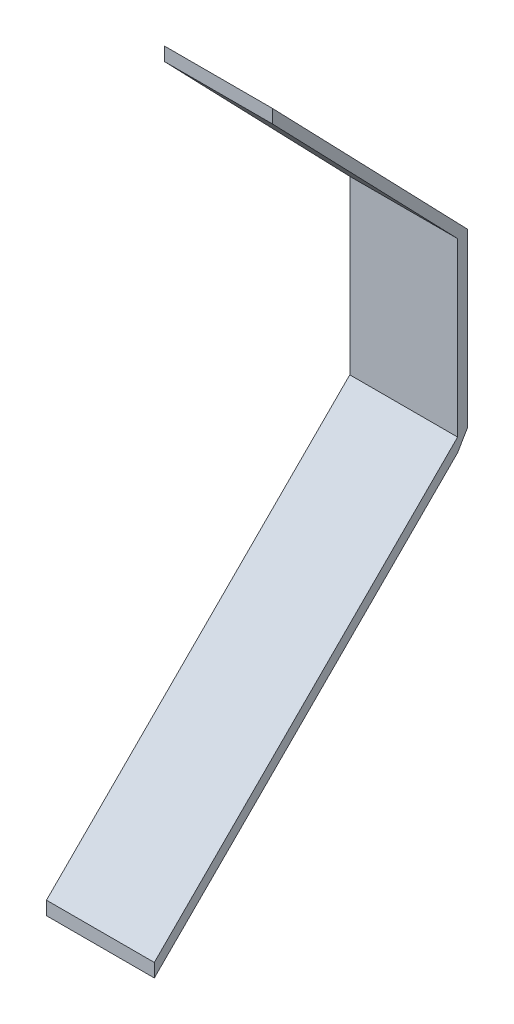
ISO-10303-21;
HEADER;
FILE_DESCRIPTION(('STEP AP214'),'2;1');
FILE_NAME('part.step','',(''),(''),'','','');
FILE_SCHEMA(('AUTOMOTIVE_DESIGN { 1 0 10303 214 1 1 1 1 }'));
ENDSEC;
DATA;
#1=APPLICATION_CONTEXT('core data for automotive mechanical design processes');
#2=APPLICATION_PROTOCOL_DEFINITION('international standard','automotive_design',2000,#1);
#3=PRODUCT_CONTEXT('',#1,'mechanical');
#4=PRODUCT('Part','Part','',(#3));
#5=PRODUCT_RELATED_PRODUCT_CATEGORY('part','',(#4));
#6=PRODUCT_DEFINITION_FORMATION('','',#4);
#7=PRODUCT_DEFINITION_CONTEXT('part definition',#1,'design');
#8=PRODUCT_DEFINITION('design','',#6,#7);
#9=PRODUCT_DEFINITION_SHAPE('','',#8);
#10=(LENGTH_UNIT() NAMED_UNIT(*) SI_UNIT(.MILLI.,.METRE.));
#11=(NAMED_UNIT(*) PLANE_ANGLE_UNIT() SI_UNIT($,.RADIAN.));
#12=(NAMED_UNIT(*) SI_UNIT($,.STERADIAN.) SOLID_ANGLE_UNIT());
#13=UNCERTAINTY_MEASURE_WITH_UNIT(LENGTH_MEASURE(1.E-05),#10,'distance_accuracy_value','');
#14=(GEOMETRIC_REPRESENTATION_CONTEXT(3) GLOBAL_UNCERTAINTY_ASSIGNED_CONTEXT((#13)) GLOBAL_UNIT_ASSIGNED_CONTEXT((#10,
#11,#12)) REPRESENTATION_CONTEXT('',''));
#15=CARTESIAN_POINT('',(0.,0.,0.));
#16=DIRECTION('',(0.,0.,1.));
#17=DIRECTION('',(1.,0.,0.));
#18=AXIS2_PLACEMENT_3D('',#15,#16,#17);
#19=CARTESIAN_POINT('',(32.,0.,0.));
#20=DIRECTION('',(0.,0.707106781186546,0.707106781186549));
#21=DIRECTION('',(0.,-0.707106781186549,0.707106781186546));
#22=AXIS2_PLACEMENT_3D('',#19,#20,#21);
#23=PLANE('',#22);
#24=DIRECTION('',(0.,0.707106781186549,-0.707106781186546));
#25=VECTOR('',#24,1.);
#26=CARTESIAN_POINT('',(0.,0.,0.));
#27=LINE('',#26,#25);
#28=CARTESIAN_POINT('',(0.,0.,0.));
#29=VERTEX_POINT('',#28);
#30=CARTESIAN_POINT('',(0.,90.0000000000003,-90.));
#31=VERTEX_POINT('',#30);
#32=EDGE_CURVE('E146',#29,#31,#27,.T.);
#33=ORIENTED_EDGE('',*,*,#32,.T.);
#34=DIRECTION('',(-1.,0.,0.));
#35=VECTOR('',#34,1.);
#36=CARTESIAN_POINT('',(32.,90.0000000000003,-90.));
#37=LINE('',#36,#35);
#38=CARTESIAN_POINT('',(32.,90.0000000000003,-90.));
#39=VERTEX_POINT('',#38);
#40=EDGE_CURVE('E11',#39,#31,#37,.T.);
#41=ORIENTED_EDGE('',*,*,#40,.F.);
#42=DIRECTION('',(0.,0.707106781186549,-0.707106781186546));
#43=VECTOR('',#42,1.);
#44=CARTESIAN_POINT('',(32.,0.,0.));
#45=LINE('',#44,#43);
#46=CARTESIAN_POINT('',(32.,0.,0.));
#47=VERTEX_POINT('',#46);
#48=EDGE_CURVE('E172',#47,#39,#45,.T.);
#49=ORIENTED_EDGE('',*,*,#48,.F.);
#50=DIRECTION('',(-1.,0.,0.));
#51=VECTOR('',#50,1.);
#52=CARTESIAN_POINT('',(32.,0.,0.));
#53=LINE('',#52,#51);
#54=EDGE_CURVE('E142',#47,#29,#53,.T.);
#55=ORIENTED_EDGE('',*,*,#54,.T.);
#56=EDGE_LOOP('',(#33,#41,#49,#55));
#57=FACE_BOUND('',#56,.T.);
#58=ADVANCED_FACE('F39',(#57),#23,.F.);
#59=CARTESIAN_POINT('',(32.,90.0000000000003,-90.));
#60=DIRECTION('',(0.,0.509841225874766,0.86026851877685));
#61=DIRECTION('',(0.,-0.86026851877685,0.509841225874766));
#62=AXIS2_PLACEMENT_3D('',#59,#60,#61);
#63=PLANE('',#62);
#64=DIRECTION('',(0.,0.86026851877685,-0.509841225874766));
#65=VECTOR('',#64,1.);
#66=CARTESIAN_POINT('',(0.,90.0000000000003,-90.));
#67=LINE('',#66,#65);
#68=CARTESIAN_POINT('',(0.,94.956001150023,-92.9371918727852));
#69=VERTEX_POINT('',#68);
#70=EDGE_CURVE('E150',#31,#69,#67,.T.);
#71=ORIENTED_EDGE('',*,*,#70,.T.);
#72=DIRECTION('',(-1.,0.,0.));
#73=VECTOR('',#72,1.);
#74=CARTESIAN_POINT('',(32.,94.956001150023,-92.9371918727852));
#75=LINE('',#74,#73);
#76=CARTESIAN_POINT('',(32.,94.956001150023,-92.9371918727852));
#77=VERTEX_POINT('',#76);
#78=EDGE_CURVE('E48',#77,#69,#75,.T.);
#79=ORIENTED_EDGE('',*,*,#78,.F.);
#80=DIRECTION('',(0.,0.86026851877685,-0.509841225874766));
#81=VECTOR('',#80,1.);
#82=CARTESIAN_POINT('',(32.,90.0000000000003,-90.));
#83=LINE('',#82,#81);
#84=EDGE_CURVE('E102',#39,#77,#83,.T.);
#85=ORIENTED_EDGE('',*,*,#84,.F.);
#86=ORIENTED_EDGE('',*,*,#40,.T.);
#87=EDGE_LOOP('',(#71,#79,#85,#86));
#88=FACE_BOUND('',#87,.T.);
#89=ADVANCED_FACE('F227',(#88),#63,.F.);
#90=CARTESIAN_POINT('',(32.,94.956001150023,-92.9371918727852));
#91=DIRECTION('',(0.,0.,1.));
#92=DIRECTION('',(0.,-1.,0.));
#93=AXIS2_PLACEMENT_3D('',#90,#91,#92);
#94=PLANE('',#93);
#95=DIRECTION('',(0.,1.,0.));
#96=VECTOR('',#95,1.);
#97=CARTESIAN_POINT('',(0.,94.956001150023,-92.9371918727852));
#98=LINE('',#97,#96);
#99=CARTESIAN_POINT('',(0.,145.956001150024,-92.9371918727852));
#100=VERTEX_POINT('',#99);
#101=EDGE_CURVE('E153',#69,#100,#98,.T.);
#102=ORIENTED_EDGE('',*,*,#101,.T.);
#103=DIRECTION('',(-1.,0.,0.));
#104=VECTOR('',#103,1.);
#105=CARTESIAN_POINT('',(32.,145.956001150024,-92.9371918727852));
#106=LINE('',#105,#104);
#107=CARTESIAN_POINT('',(32.,145.956001150024,-92.9371918727852));
#108=VERTEX_POINT('',#107);
#109=EDGE_CURVE('E187',#108,#100,#106,.T.);
#110=ORIENTED_EDGE('',*,*,#109,.F.);
#111=DIRECTION('',(0.,1.,0.));
#112=VECTOR('',#111,1.);
#113=CARTESIAN_POINT('',(32.,94.956001150023,-92.9371918727852));
#114=LINE('',#113,#112);
#115=EDGE_CURVE('E197',#77,#108,#114,.T.);
#116=ORIENTED_EDGE('',*,*,#115,.F.);
#117=ORIENTED_EDGE('',*,*,#78,.T.);
#118=EDGE_LOOP('',(#102,#110,#116,#117));
#119=FACE_BOUND('',#118,.T.);
#120=ADVANCED_FACE('F195',(#119),#94,.F.);
#121=CARTESIAN_POINT('',(32.,206.,-35.));
#122=DIRECTION('',(0.,-0.694369173833102,0.71961896197247));
#123=DIRECTION('',(0.,-0.71961896197247,-0.694369173833102));
#124=AXIS2_PLACEMENT_3D('',#121,#122,#123);
#125=PLANE('',#124);
#126=DIRECTION('',(0.,0.71961896197247,0.694369173833102));
#127=VECTOR('',#126,1.);
#128=CARTESIAN_POINT('',(0.,206.,-35.));
#129=LINE('',#128,#127);
#130=CARTESIAN_POINT('',(0.,206.,-35.));
#131=VERTEX_POINT('',#130);
#132=EDGE_CURVE('E157',#100,#131,#129,.T.);
#133=ORIENTED_EDGE('',*,*,#132,.T.);
#134=DIRECTION('',(-1.,0.,0.));
#135=VECTOR('',#134,1.);
#136=CARTESIAN_POINT('',(32.,206.,-35.));
#137=LINE('',#136,#135);
#138=CARTESIAN_POINT('',(32.,206.,-35.));
#139=VERTEX_POINT('',#138);
#140=EDGE_CURVE('E183',#139,#131,#137,.T.);
#141=ORIENTED_EDGE('',*,*,#140,.F.);
#142=DIRECTION('',(0.,0.719618961972469,0.694369173833103));
#143=VECTOR('',#142,1.);
#144=CARTESIAN_POINT('',(32.,149.000000000001,-90.));
#145=LINE('',#144,#143);
#146=EDGE_CURVE('E213',#108,#139,#145,.T.);
#147=ORIENTED_EDGE('',*,*,#146,.F.);
#148=ORIENTED_EDGE('',*,*,#109,.T.);
#149=EDGE_LOOP('',(#133,#141,#147,#148));
#150=FACE_BOUND('',#149,.T.);
#151=ADVANCED_FACE('F205',(#150),#125,.F.);
#152=CARTESIAN_POINT('',(32.,202.,-35.));
#153=DIRECTION('',(0.,0.,-1.));
#154=DIRECTION('',(0.,1.,0.));
#155=AXIS2_PLACEMENT_3D('',#152,#153,#154);
#156=PLANE('',#155);
#157=DIRECTION('',(0.,-1.,0.));
#158=VECTOR('',#157,1.);
#159=CARTESIAN_POINT('',(0.,202.,-35.));
#160=LINE('',#159,#158);
#161=CARTESIAN_POINT('',(0.,202.,-35.));
#162=VERTEX_POINT('',#161);
#163=EDGE_CURVE('E160',#131,#162,#160,.T.);
#164=ORIENTED_EDGE('',*,*,#163,.T.);
#165=DIRECTION('',(-1.,0.,0.));
#166=VECTOR('',#165,1.);
#167=CARTESIAN_POINT('',(32.,202.,-35.));
#168=LINE('',#167,#166);
#169=CARTESIAN_POINT('',(32.,202.,-35.));
#170=VERTEX_POINT('',#169);
#171=EDGE_CURVE('E179',#170,#162,#168,.T.);
#172=ORIENTED_EDGE('',*,*,#171,.F.);
#173=DIRECTION('',(0.,-1.,0.));
#174=VECTOR('',#173,1.);
#175=CARTESIAN_POINT('',(32.,202.,-35.));
#176=LINE('',#175,#174);
#177=EDGE_CURVE('E211',#139,#170,#176,.T.);
#178=ORIENTED_EDGE('',*,*,#177,.F.);
#179=ORIENTED_EDGE('',*,*,#140,.T.);
#180=EDGE_LOOP('',(#164,#172,#178,#179));
#181=FACE_BOUND('',#180,.T.);
#182=ADVANCED_FACE('F209',(#181),#156,.F.);
#183=CARTESIAN_POINT('',(32.,202.,-35.));
#184=DIRECTION('',(0.,0.694369173833102,-0.71961896197247));
#185=DIRECTION('',(0.,0.71961896197247,0.694369173833102));
#186=AXIS2_PLACEMENT_3D('',#183,#184,#185);
#187=PLANE('',#186);
#188=DIRECTION('',(0.,-0.71961896197247,-0.694369173833102));
#189=VECTOR('',#188,1.);
#190=CARTESIAN_POINT('',(0.,202.,-35.));
#191=LINE('',#190,#189);
#192=CARTESIAN_POINT('',(0.,145.000000000001,-90.));
#193=VERTEX_POINT('',#192);
#194=EDGE_CURVE('E163',#162,#193,#191,.T.);
#195=ORIENTED_EDGE('',*,*,#194,.T.);
#196=DIRECTION('',(-1.,0.,0.));
#197=VECTOR('',#196,1.);
#198=CARTESIAN_POINT('',(32.,145.000000000001,-90.));
#199=LINE('',#198,#197);
#200=CARTESIAN_POINT('',(32.,145.000000000001,-90.));
#201=VERTEX_POINT('',#200);
#202=EDGE_CURVE('E135',#201,#193,#199,.T.);
#203=ORIENTED_EDGE('',*,*,#202,.F.);
#204=DIRECTION('',(0.,-0.71961896197247,-0.694369173833102));
#205=VECTOR('',#204,1.);
#206=CARTESIAN_POINT('',(32.,202.,-35.));
#207=LINE('',#206,#205);
#208=EDGE_CURVE('E124',#170,#201,#207,.T.);
#209=ORIENTED_EDGE('',*,*,#208,.F.);
#210=ORIENTED_EDGE('',*,*,#171,.T.);
#211=EDGE_LOOP('',(#195,#203,#209,#210));
#212=FACE_BOUND('',#211,.T.);
#213=ADVANCED_FACE('F239',(#212),#187,.F.);
#214=CARTESIAN_POINT('',(32.,145.000000000001,-90.));
#215=DIRECTION('',(0.,0.,-1.));
#216=DIRECTION('',(-1.,0.,0.));
#217=AXIS2_PLACEMENT_3D('',#214,#215,#216);
#218=PLANE('',#217);
#219=DIRECTION('',(0.,-1.,0.));
#220=VECTOR('',#219,1.);
#221=CARTESIAN_POINT('',(0.,145.000000000001,-90.));
#222=LINE('',#221,#220);
#223=CARTESIAN_POINT('',(0.,94.0000000000003,-90.));
#224=VERTEX_POINT('',#223);
#225=EDGE_CURVE('E133',#193,#224,#222,.T.);
#226=ORIENTED_EDGE('',*,*,#225,.T.);
#227=DIRECTION('',(-1.,0.,0.));
#228=VECTOR('',#227,1.);
#229=CARTESIAN_POINT('',(32.,94.0000000000003,-90.));
#230=LINE('',#229,#228);
#231=CARTESIAN_POINT('',(32.,94.0000000000003,-90.));
#232=VERTEX_POINT('',#231);
#233=EDGE_CURVE('E130',#232,#224,#230,.T.);
#234=ORIENTED_EDGE('',*,*,#233,.F.);
#235=DIRECTION('',(0.,-1.,0.));
#236=VECTOR('',#235,1.);
#237=CARTESIAN_POINT('',(32.,145.000000000001,-90.));
#238=LINE('',#237,#236);
#239=EDGE_CURVE('E118',#201,#232,#238,.T.);
#240=ORIENTED_EDGE('',*,*,#239,.F.);
#241=ORIENTED_EDGE('',*,*,#202,.T.);
#242=EDGE_LOOP('',(#226,#234,#240,#241));
#243=FACE_BOUND('',#242,.T.);
#244=ADVANCED_FACE('F131',(#243),#218,.F.);
#245=CARTESIAN_POINT('',(32.,4.,0.));
#246=DIRECTION('',(0.,-0.707106781186546,-0.707106781186549));
#247=DIRECTION('',(0.,0.707106781186549,-0.707106781186546));
#248=AXIS2_PLACEMENT_3D('',#245,#246,#247);
#249=PLANE('',#248);
#250=DIRECTION('',(0.,-0.707106781186549,0.707106781186546));
#251=VECTOR('',#250,1.);
#252=CARTESIAN_POINT('',(0.,4.,0.));
#253=LINE('',#252,#251);
#254=CARTESIAN_POINT('',(0.,4.,0.));
#255=VERTEX_POINT('',#254);
#256=EDGE_CURVE('E88',#224,#255,#253,.T.);
#257=ORIENTED_EDGE('',*,*,#256,.T.);
#258=DIRECTION('',(-1.,0.,0.));
#259=VECTOR('',#258,1.);
#260=CARTESIAN_POINT('',(32.,4.,0.));
#261=LINE('',#260,#259);
#262=CARTESIAN_POINT('',(32.,4.,0.));
#263=VERTEX_POINT('',#262);
#264=EDGE_CURVE('E136',#263,#255,#261,.T.);
#265=ORIENTED_EDGE('',*,*,#264,.F.);
#266=DIRECTION('',(0.,-0.707106781186549,0.707106781186546));
#267=VECTOR('',#266,1.);
#268=CARTESIAN_POINT('',(32.,4.,0.));
#269=LINE('',#268,#267);
#270=EDGE_CURVE('E122',#232,#263,#269,.T.);
#271=ORIENTED_EDGE('',*,*,#270,.F.);
#272=ORIENTED_EDGE('',*,*,#233,.T.);
#273=EDGE_LOOP('',(#257,#265,#271,#272));
#274=FACE_BOUND('',#273,.T.);
#275=ADVANCED_FACE('F138',(#274),#249,.F.);
#276=CARTESIAN_POINT('',(32.,4.,0.));
#277=DIRECTION('',(0.,0.,-1.));
#278=DIRECTION('',(-1.,0.,0.));
#279=AXIS2_PLACEMENT_3D('',#276,#277,#278);
#280=PLANE('',#279);
#281=DIRECTION('',(0.,-1.,0.));
#282=VECTOR('',#281,1.);
#283=CARTESIAN_POINT('',(0.,4.,0.));
#284=LINE('',#283,#282);
#285=EDGE_CURVE('E94',#255,#29,#284,.T.);
#286=ORIENTED_EDGE('',*,*,#285,.T.);
#287=ORIENTED_EDGE('',*,*,#54,.F.);
#288=DIRECTION('',(0.,-1.,0.));
#289=VECTOR('',#288,1.);
#290=CARTESIAN_POINT('',(32.,4.,0.));
#291=LINE('',#290,#289);
#292=EDGE_CURVE('E56',#263,#47,#291,.T.);
#293=ORIENTED_EDGE('',*,*,#292,.F.);
#294=ORIENTED_EDGE('',*,*,#264,.T.);
#295=EDGE_LOOP('',(#286,#287,#293,#294));
#296=FACE_BOUND('',#295,.T.);
#297=ADVANCED_FACE('F247',(#296),#280,.F.);
#298=CARTESIAN_POINT('',(32.,0.,0.));
#299=DIRECTION('',(-1.,0.,0.));
#300=DIRECTION('',(0.,0.,1.));
#301=AXIS2_PLACEMENT_3D('',#298,#299,#300);
#302=PLANE('',#301);
#303=ORIENTED_EDGE('',*,*,#48,.T.);
#304=ORIENTED_EDGE('',*,*,#84,.T.);
#305=ORIENTED_EDGE('',*,*,#115,.T.);
#306=ORIENTED_EDGE('',*,*,#146,.T.);
#307=ORIENTED_EDGE('',*,*,#177,.T.);
#308=ORIENTED_EDGE('',*,*,#208,.T.);
#309=ORIENTED_EDGE('',*,*,#239,.T.);
#310=ORIENTED_EDGE('',*,*,#270,.T.);
#311=ORIENTED_EDGE('',*,*,#292,.T.);
#312=EDGE_LOOP('',(#303,#304,#305,#306,#307,#308,#309,#310,#311));
#313=FACE_BOUND('',#312,.T.);
#314=ADVANCED_FACE('F120',(#313),#302,.F.);
#315=CARTESIAN_POINT('',(0.,0.,0.));
#316=DIRECTION('',(-1.,0.,0.));
#317=DIRECTION('',(0.,0.,1.));
#318=AXIS2_PLACEMENT_3D('',#315,#316,#317);
#319=PLANE('',#318);
#320=ORIENTED_EDGE('',*,*,#32,.F.);
#321=ORIENTED_EDGE('',*,*,#285,.F.);
#322=ORIENTED_EDGE('',*,*,#256,.F.);
#323=ORIENTED_EDGE('',*,*,#225,.F.);
#324=ORIENTED_EDGE('',*,*,#194,.F.);
#325=ORIENTED_EDGE('',*,*,#163,.F.);
#326=ORIENTED_EDGE('',*,*,#132,.F.);
#327=ORIENTED_EDGE('',*,*,#101,.F.);
#328=ORIENTED_EDGE('',*,*,#70,.F.);
#329=EDGE_LOOP('',(#320,#321,#322,#323,#324,#325,#326,#327,#328));
#330=FACE_BOUND('',#329,.T.);
#331=ADVANCED_FACE('F200',(#330),#319,.T.);
#332=CLOSED_SHELL('',(#58,#89,#120,#151,#182,#213,#244,#275,#297,#314,#331));
#333=MANIFOLD_SOLID_BREP('B2',#332);
#334=ADVANCED_BREP_SHAPE_REPRESENTATION('',(#18,#333),#14);
#335=SHAPE_DEFINITION_REPRESENTATION(#9,#334);
ENDSEC;
END-ISO-10303-21;
